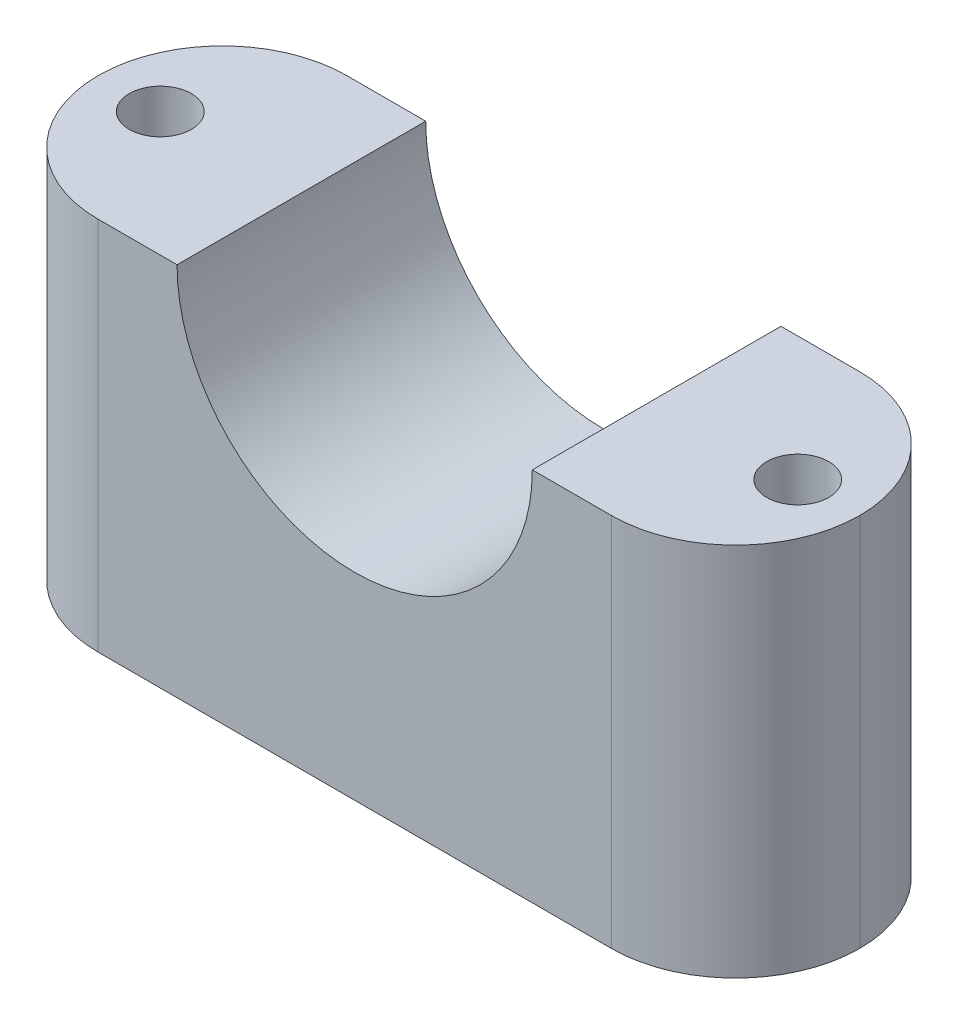
ISO-10303-21;
HEADER;
FILE_DESCRIPTION(('STEP AP214'),'2;1');
FILE_NAME('part.step','',(''),(''),'','','');
FILE_SCHEMA(('AUTOMOTIVE_DESIGN { 1 0 10303 214 1 1 1 1 }'));
ENDSEC;
DATA;
#1=APPLICATION_CONTEXT('core data for automotive mechanical design processes');
#2=APPLICATION_PROTOCOL_DEFINITION('international standard','automotive_design',2000,#1);
#3=PRODUCT_CONTEXT('',#1,'mechanical');
#4=PRODUCT('Part','Part','',(#3));
#5=PRODUCT_RELATED_PRODUCT_CATEGORY('part','',(#4));
#6=PRODUCT_DEFINITION_FORMATION('','',#4);
#7=PRODUCT_DEFINITION_CONTEXT('part definition',#1,'design');
#8=PRODUCT_DEFINITION('design','',#6,#7);
#9=PRODUCT_DEFINITION_SHAPE('','',#8);
#10=(LENGTH_UNIT() NAMED_UNIT(*) SI_UNIT(.MILLI.,.METRE.));
#11=(NAMED_UNIT(*) PLANE_ANGLE_UNIT() SI_UNIT($,.RADIAN.));
#12=(NAMED_UNIT(*) SI_UNIT($,.STERADIAN.) SOLID_ANGLE_UNIT());
#13=UNCERTAINTY_MEASURE_WITH_UNIT(LENGTH_MEASURE(1.E-05),#10,'distance_accuracy_value','');
#14=(GEOMETRIC_REPRESENTATION_CONTEXT(3) GLOBAL_UNCERTAINTY_ASSIGNED_CONTEXT((#13)) GLOBAL_UNIT_ASSIGNED_CONTEXT((#10,
#11,#12)) REPRESENTATION_CONTEXT('',''));
#15=CARTESIAN_POINT('',(0.,0.,0.));
#16=DIRECTION('',(0.,0.,1.));
#17=DIRECTION('',(1.,0.,0.));
#18=AXIS2_PLACEMENT_3D('',#15,#16,#17);
#19=CARTESIAN_POINT('',(41.02154,24.13,-7.99846));
#20=DIRECTION('',(0.,1.,0.));
#21=DIRECTION('',(0.,0.,1.));
#22=AXIS2_PLACEMENT_3D('',#19,#20,#21);
#23=PLANE('',#22);
#24=DIRECTION('',(0.,0.,1.));
#25=VECTOR('',#24,1.);
#26=CARTESIAN_POINT('',(13.08,24.13,-16.002));
#27=LINE('',#26,#25);
#28=CARTESIAN_POINT('',(13.08,24.13,-16.002));
#29=VERTEX_POINT('',#28);
#30=CARTESIAN_POINT('',(13.08,24.13,0.));
#31=VERTEX_POINT('',#30);
#32=EDGE_CURVE('E51',#29,#31,#27,.T.);
#33=ORIENTED_EDGE('',*,*,#32,.F.);
#34=DIRECTION('',(-1.,0.,0.));
#35=VECTOR('',#34,1.);
#36=CARTESIAN_POINT('',(7.99846000000006,24.13,-16.002));
#37=LINE('',#36,#35);
#38=CARTESIAN_POINT('',(7.99846000000006,24.13,-16.002));
#39=VERTEX_POINT('',#38);
#40=EDGE_CURVE('E202',#29,#39,#37,.T.);
#41=ORIENTED_EDGE('',*,*,#40,.T.);
#42=CARTESIAN_POINT('',(7.99846,24.13,-8.00354));
#43=DIRECTION('',(0.,1.,0.));
#44=DIRECTION('',(0.,0.,1.));
#45=AXIS2_PLACEMENT_3D('',#42,#43,#44);
#46=CIRCLE('',#45,7.99846);
#47=CARTESIAN_POINT('',(0.,24.13,-8.00353999999994));
#48=VERTEX_POINT('',#47);
#49=EDGE_CURVE('E126',#39,#48,#46,.T.);
#50=ORIENTED_EDGE('',*,*,#49,.T.);
#51=DIRECTION('',(0.,0.,1.));
#52=VECTOR('',#51,1.);
#53=CARTESIAN_POINT('',(0.,24.13,-7.99846000000006));
#54=LINE('',#53,#52);
#55=CARTESIAN_POINT('',(0.,24.13,-7.99846000000006));
#56=VERTEX_POINT('',#55);
#57=EDGE_CURVE('E118',#48,#56,#54,.T.);
#58=ORIENTED_EDGE('',*,*,#57,.T.);
#59=CARTESIAN_POINT('',(7.99846,24.13,-7.99846));
#60=DIRECTION('',(0.,1.,0.));
#61=DIRECTION('',(0.,0.,1.));
#62=AXIS2_PLACEMENT_3D('',#59,#60,#61);
#63=CIRCLE('',#62,7.99846);
#64=CARTESIAN_POINT('',(7.99846000000006,24.13,0.));
#65=VERTEX_POINT('',#64);
#66=EDGE_CURVE('E123',#56,#65,#63,.T.);
#67=ORIENTED_EDGE('',*,*,#66,.T.);
#68=DIRECTION('',(1.,0.,0.));
#69=VECTOR('',#68,1.);
#70=CARTESIAN_POINT('',(7.99846000000006,24.13,0.));
#71=LINE('',#70,#69);
#72=EDGE_CURVE('E144',#65,#31,#71,.T.);
#73=ORIENTED_EDGE('',*,*,#72,.T.);
#74=EDGE_LOOP('',(#33,#41,#50,#58,#67,#73));
#75=FACE_BOUND('',#74,.T.);
#76=CARTESIAN_POINT('',(4.,24.13,-8.001));
#77=DIRECTION('',(0.,1.,0.));
#78=DIRECTION('',(0.,0.,1.));
#79=AXIS2_PLACEMENT_3D('',#76,#77,#78);
#80=CIRCLE('',#79,2.);
#81=CARTESIAN_POINT('',(4.,24.13,-10.001));
#82=VERTEX_POINT('',#81);
#83=EDGE_CURVE('E153',#82,#82,#80,.T.);
#84=ORIENTED_EDGE('',*,*,#83,.F.);
#85=EDGE_LOOP('',(#84));
#86=FACE_BOUND('',#85,.T.);
#87=ADVANCED_FACE('F36',(#75,#86),#23,.T.);
#88=DIRECTION('',(0.,0.,1.));
#89=VECTOR('',#88,1.);
#90=CARTESIAN_POINT('',(35.94,24.13,-16.002));
#91=LINE('',#90,#89);
#92=CARTESIAN_POINT('',(35.94,24.13,0.));
#93=VERTEX_POINT('',#92);
#94=CARTESIAN_POINT('',(35.94,24.13,-16.002));
#95=VERTEX_POINT('',#94);
#96=EDGE_CURVE('E221',#93,#95,#91,.F.);
#97=ORIENTED_EDGE('',*,*,#96,.F.);
#98=CARTESIAN_POINT('',(41.0215399999999,24.13,0.));
#99=VERTEX_POINT('',#98);
#100=EDGE_CURVE('E59',#93,#99,#71,.T.);
#101=ORIENTED_EDGE('',*,*,#100,.T.);
#102=CARTESIAN_POINT('',(41.02154,24.13,-7.99846));
#103=DIRECTION('',(0.,1.,0.));
#104=DIRECTION('',(0.,0.,1.));
#105=AXIS2_PLACEMENT_3D('',#102,#103,#104);
#106=CIRCLE('',#105,7.99846);
#107=CARTESIAN_POINT('',(49.02,24.13,-7.99846000000006));
#108=VERTEX_POINT('',#107);
#109=EDGE_CURVE('E165',#99,#108,#106,.T.);
#110=ORIENTED_EDGE('',*,*,#109,.T.);
#111=DIRECTION('',(0.,0.,-1.));
#112=VECTOR('',#111,1.);
#113=CARTESIAN_POINT('',(49.02,24.13,-7.99846000000006));
#114=LINE('',#113,#112);
#115=CARTESIAN_POINT('',(49.02,24.13,-8.00353999999994));
#116=VERTEX_POINT('',#115);
#117=EDGE_CURVE('E102',#108,#116,#114,.T.);
#118=ORIENTED_EDGE('',*,*,#117,.T.);
#119=CARTESIAN_POINT('',(41.02154,24.13,-8.00354));
#120=DIRECTION('',(0.,1.,0.));
#121=DIRECTION('',(0.,0.,1.));
#122=AXIS2_PLACEMENT_3D('',#119,#120,#121);
#123=CIRCLE('',#122,7.99846);
#124=CARTESIAN_POINT('',(41.0215399999999,24.13,-16.002));
#125=VERTEX_POINT('',#124);
#126=EDGE_CURVE('E204',#116,#125,#123,.T.);
#127=ORIENTED_EDGE('',*,*,#126,.T.);
#128=EDGE_CURVE('E199',#125,#95,#37,.T.);
#129=ORIENTED_EDGE('',*,*,#128,.T.);
#130=EDGE_LOOP('',(#97,#101,#110,#118,#127,#129));
#131=FACE_BOUND('',#130,.T.);
#132=CARTESIAN_POINT('',(45.02,24.13,-8.001));
#133=DIRECTION('',(0.,1.,0.));
#134=DIRECTION('',(0.,0.,1.));
#135=AXIS2_PLACEMENT_3D('',#132,#133,#134);
#136=CIRCLE('',#135,2.);
#137=CARTESIAN_POINT('',(45.02,24.13,-10.001));
#138=VERTEX_POINT('',#137);
#139=EDGE_CURVE('E212',#138,#138,#136,.T.);
#140=ORIENTED_EDGE('',*,*,#139,.F.);
#141=EDGE_LOOP('',(#140));
#142=FACE_BOUND('',#141,.T.);
#143=ADVANCED_FACE('F227',(#131,#142),#23,.T.);
#144=CARTESIAN_POINT('',(41.02154,0.,-7.99846));
#145=DIRECTION('',(0.,1.,0.));
#146=DIRECTION('',(0.,0.,1.));
#147=AXIS2_PLACEMENT_3D('',#144,#145,#146);
#148=PLANE('',#147);
#149=CARTESIAN_POINT('',(41.02154,0.,-7.99846));
#150=DIRECTION('',(0.,1.,0.));
#151=DIRECTION('',(0.,0.,1.));
#152=AXIS2_PLACEMENT_3D('',#149,#150,#151);
#153=CIRCLE('',#152,7.99846);
#154=CARTESIAN_POINT('',(41.0215399999999,0.,0.));
#155=VERTEX_POINT('',#154);
#156=CARTESIAN_POINT('',(49.02,0.,-7.99846000000006));
#157=VERTEX_POINT('',#156);
#158=EDGE_CURVE('E149',#155,#157,#153,.T.);
#159=ORIENTED_EDGE('',*,*,#158,.F.);
#160=DIRECTION('',(1.,0.,0.));
#161=VECTOR('',#160,1.);
#162=CARTESIAN_POINT('',(7.99846000000006,0.,0.));
#163=LINE('',#162,#161);
#164=CARTESIAN_POINT('',(7.99846000000006,0.,0.));
#165=VERTEX_POINT('',#164);
#166=EDGE_CURVE('E93',#165,#155,#163,.T.);
#167=ORIENTED_EDGE('',*,*,#166,.F.);
#168=CARTESIAN_POINT('',(7.99846,0.,-7.99846));
#169=DIRECTION('',(0.,1.,0.));
#170=DIRECTION('',(0.,0.,1.));
#171=AXIS2_PLACEMENT_3D('',#168,#169,#170);
#172=CIRCLE('',#171,7.99846);
#173=CARTESIAN_POINT('',(0.,0.,-7.99846000000006));
#174=VERTEX_POINT('',#173);
#175=EDGE_CURVE('E162',#174,#165,#172,.T.);
#176=ORIENTED_EDGE('',*,*,#175,.F.);
#177=DIRECTION('',(0.,0.,1.));
#178=VECTOR('',#177,1.);
#179=CARTESIAN_POINT('',(0.,0.,-7.99846000000006));
#180=LINE('',#179,#178);
#181=CARTESIAN_POINT('',(0.,0.,-8.00353999999994));
#182=VERTEX_POINT('',#181);
#183=EDGE_CURVE('E135',#182,#174,#180,.T.);
#184=ORIENTED_EDGE('',*,*,#183,.F.);
#185=CARTESIAN_POINT('',(7.99846,0.,-8.00354));
#186=DIRECTION('',(0.,1.,0.));
#187=DIRECTION('',(0.,0.,1.));
#188=AXIS2_PLACEMENT_3D('',#185,#186,#187);
#189=CIRCLE('',#188,7.99846);
#190=CARTESIAN_POINT('',(7.99846000000006,0.,-16.002));
#191=VERTEX_POINT('',#190);
#192=EDGE_CURVE('E159',#191,#182,#189,.T.);
#193=ORIENTED_EDGE('',*,*,#192,.F.);
#194=DIRECTION('',(-1.,0.,0.));
#195=VECTOR('',#194,1.);
#196=CARTESIAN_POINT('',(7.99846000000006,0.,-16.002));
#197=LINE('',#196,#195);
#198=CARTESIAN_POINT('',(41.0215399999999,0.,-16.002));
#199=VERTEX_POINT('',#198);
#200=EDGE_CURVE('E157',#199,#191,#197,.T.);
#201=ORIENTED_EDGE('',*,*,#200,.F.);
#202=CARTESIAN_POINT('',(41.02154,0.,-8.00354));
#203=DIRECTION('',(0.,1.,0.));
#204=DIRECTION('',(0.,0.,1.));
#205=AXIS2_PLACEMENT_3D('',#202,#203,#204);
#206=CIRCLE('',#205,7.99846);
#207=CARTESIAN_POINT('',(49.02,0.,-8.00353999999994));
#208=VERTEX_POINT('',#207);
#209=EDGE_CURVE('E155',#208,#199,#206,.T.);
#210=ORIENTED_EDGE('',*,*,#209,.F.);
#211=DIRECTION('',(0.,0.,-1.));
#212=VECTOR('',#211,1.);
#213=CARTESIAN_POINT('',(49.02,0.,-7.99846000000006));
#214=LINE('',#213,#212);
#215=EDGE_CURVE('E152',#157,#208,#214,.T.);
#216=ORIENTED_EDGE('',*,*,#215,.F.);
#217=EDGE_LOOP('',(#159,#167,#176,#184,#193,#201,#210,#216));
#218=FACE_BOUND('',#217,.T.);
#219=CARTESIAN_POINT('',(4.,0.,-8.001));
#220=DIRECTION('',(0.,1.,0.));
#221=DIRECTION('',(0.,0.,1.));
#222=AXIS2_PLACEMENT_3D('',#219,#220,#221);
#223=CIRCLE('',#222,2.);
#224=CARTESIAN_POINT('',(4.,0.,-10.001));
#225=VERTEX_POINT('',#224);
#226=EDGE_CURVE('E209',#225,#225,#223,.T.);
#227=ORIENTED_EDGE('',*,*,#226,.T.);
#228=EDGE_LOOP('',(#227));
#229=FACE_BOUND('',#228,.T.);
#230=CARTESIAN_POINT('',(45.02,0.,-8.001));
#231=DIRECTION('',(0.,1.,0.));
#232=DIRECTION('',(0.,0.,1.));
#233=AXIS2_PLACEMENT_3D('',#230,#231,#232);
#234=CIRCLE('',#233,2.);
#235=CARTESIAN_POINT('',(45.02,0.,-10.001));
#236=VERTEX_POINT('',#235);
#237=EDGE_CURVE('E215',#236,#236,#234,.T.);
#238=ORIENTED_EDGE('',*,*,#237,.T.);
#239=EDGE_LOOP('',(#238));
#240=FACE_BOUND('',#239,.T.);
#241=ADVANCED_FACE('F183',(#218,#229,#240),#148,.F.);
#242=CARTESIAN_POINT('',(41.02154,24.13,-7.99846));
#243=DIRECTION('',(0.,-1.,0.));
#244=DIRECTION('',(0.,0.,-1.));
#245=AXIS2_PLACEMENT_3D('',#242,#243,#244);
#246=CYLINDRICAL_SURFACE('',#245,7.99846);
#247=ORIENTED_EDGE('',*,*,#158,.T.);
#248=DIRECTION('',(0.,-1.,0.));
#249=VECTOR('',#248,1.);
#250=CARTESIAN_POINT('',(49.02,24.13,-7.99846000000006));
#251=LINE('',#250,#249);
#252=EDGE_CURVE('E44',#108,#157,#251,.T.);
#253=ORIENTED_EDGE('',*,*,#252,.F.);
#254=ORIENTED_EDGE('',*,*,#109,.F.);
#255=DIRECTION('',(0.,-1.,0.));
#256=VECTOR('',#255,1.);
#257=CARTESIAN_POINT('',(41.0215399999999,24.13,0.));
#258=LINE('',#257,#256);
#259=EDGE_CURVE('E148',#99,#155,#258,.T.);
#260=ORIENTED_EDGE('',*,*,#259,.T.);
#261=EDGE_LOOP('',(#247,#253,#254,#260));
#262=FACE_BOUND('',#261,.T.);
#263=ADVANCED_FACE('F38',(#262),#246,.T.);
#264=CARTESIAN_POINT('',(49.02,24.13,-7.99846000000006));
#265=DIRECTION('',(-1.,0.,0.));
#266=DIRECTION('',(0.,0.,1.));
#267=AXIS2_PLACEMENT_3D('',#264,#265,#266);
#268=PLANE('',#267);
#269=ORIENTED_EDGE('',*,*,#215,.T.);
#270=DIRECTION('',(0.,-1.,0.));
#271=VECTOR('',#270,1.);
#272=CARTESIAN_POINT('',(49.02,24.13,-8.00353999999994));
#273=LINE('',#272,#271);
#274=EDGE_CURVE('E175',#116,#208,#273,.T.);
#275=ORIENTED_EDGE('',*,*,#274,.F.);
#276=ORIENTED_EDGE('',*,*,#117,.F.);
#277=ORIENTED_EDGE('',*,*,#252,.T.);
#278=EDGE_LOOP('',(#269,#275,#276,#277));
#279=FACE_BOUND('',#278,.T.);
#280=ADVANCED_FACE('F178',(#279),#268,.F.);
#281=CARTESIAN_POINT('',(41.02154,24.13,-8.00354));
#282=DIRECTION('',(0.,-1.,0.));
#283=DIRECTION('',(0.,0.,-1.));
#284=AXIS2_PLACEMENT_3D('',#281,#282,#283);
#285=CYLINDRICAL_SURFACE('',#284,7.99846);
#286=ORIENTED_EDGE('',*,*,#209,.T.);
#287=DIRECTION('',(0.,-1.,0.));
#288=VECTOR('',#287,1.);
#289=CARTESIAN_POINT('',(41.0215399999999,24.13,-16.002));
#290=LINE('',#289,#288);
#291=EDGE_CURVE('E172',#125,#199,#290,.T.);
#292=ORIENTED_EDGE('',*,*,#291,.F.);
#293=ORIENTED_EDGE('',*,*,#126,.F.);
#294=ORIENTED_EDGE('',*,*,#274,.T.);
#295=EDGE_LOOP('',(#286,#292,#293,#294));
#296=FACE_BOUND('',#295,.T.);
#297=ADVANCED_FACE('F190',(#296),#285,.T.);
#298=CARTESIAN_POINT('',(7.99846000000006,24.13,-16.002));
#299=DIRECTION('',(0.,0.,1.));
#300=DIRECTION('',(1.,0.,0.));
#301=AXIS2_PLACEMENT_3D('',#298,#299,#300);
#302=PLANE('',#301);
#303=ORIENTED_EDGE('',*,*,#40,.F.);
#304=CARTESIAN_POINT('',(24.51,24.13,-16.002));
#305=DIRECTION('',(0.,0.,1.));
#306=DIRECTION('',(1.,0.,0.));
#307=AXIS2_PLACEMENT_3D('',#304,#305,#306);
#308=CIRCLE('',#307,11.43);
#309=EDGE_CURVE('E201',#29,#95,#308,.T.);
#310=ORIENTED_EDGE('',*,*,#309,.T.);
#311=ORIENTED_EDGE('',*,*,#128,.F.);
#312=ORIENTED_EDGE('',*,*,#291,.T.);
#313=ORIENTED_EDGE('',*,*,#200,.T.);
#314=DIRECTION('',(0.,-1.,0.));
#315=VECTOR('',#314,1.);
#316=CARTESIAN_POINT('',(7.99846000000006,24.13,-16.002));
#317=LINE('',#316,#315);
#318=EDGE_CURVE('E169',#39,#191,#317,.T.);
#319=ORIENTED_EDGE('',*,*,#318,.F.);
#320=EDGE_LOOP('',(#303,#310,#311,#312,#313,#319));
#321=FACE_BOUND('',#320,.T.);
#322=ADVANCED_FACE('F195',(#321),#302,.F.);
#323=CARTESIAN_POINT('',(7.99846,24.13,-8.00354));
#324=DIRECTION('',(0.,-1.,0.));
#325=DIRECTION('',(0.,0.,-1.));
#326=AXIS2_PLACEMENT_3D('',#323,#324,#325);
#327=CYLINDRICAL_SURFACE('',#326,7.99846);
#328=ORIENTED_EDGE('',*,*,#192,.T.);
#329=DIRECTION('',(0.,-1.,0.));
#330=VECTOR('',#329,1.);
#331=CARTESIAN_POINT('',(0.,24.13,-8.00353999999994));
#332=LINE('',#331,#330);
#333=EDGE_CURVE('E138',#48,#182,#332,.T.);
#334=ORIENTED_EDGE('',*,*,#333,.F.);
#335=ORIENTED_EDGE('',*,*,#49,.F.);
#336=ORIENTED_EDGE('',*,*,#318,.T.);
#337=EDGE_LOOP('',(#328,#334,#335,#336));
#338=FACE_BOUND('',#337,.T.);
#339=ADVANCED_FACE('F231',(#338),#327,.T.);
#340=CARTESIAN_POINT('',(0.,24.13,-7.99846000000006));
#341=DIRECTION('',(1.,0.,0.));
#342=DIRECTION('',(0.,0.,-1.));
#343=AXIS2_PLACEMENT_3D('',#340,#341,#342);
#344=PLANE('',#343);
#345=ORIENTED_EDGE('',*,*,#183,.T.);
#346=DIRECTION('',(0.,-1.,0.));
#347=VECTOR('',#346,1.);
#348=CARTESIAN_POINT('',(0.,24.13,-7.99846000000006));
#349=LINE('',#348,#347);
#350=EDGE_CURVE('E132',#56,#174,#349,.T.);
#351=ORIENTED_EDGE('',*,*,#350,.F.);
#352=ORIENTED_EDGE('',*,*,#57,.F.);
#353=ORIENTED_EDGE('',*,*,#333,.T.);
#354=EDGE_LOOP('',(#345,#351,#352,#353));
#355=FACE_BOUND('',#354,.T.);
#356=ADVANCED_FACE('F133',(#355),#344,.F.);
#357=CARTESIAN_POINT('',(7.99846,24.13,-7.99846));
#358=DIRECTION('',(0.,-1.,0.));
#359=DIRECTION('',(0.,0.,-1.));
#360=AXIS2_PLACEMENT_3D('',#357,#358,#359);
#361=CYLINDRICAL_SURFACE('',#360,7.99846);
#362=ORIENTED_EDGE('',*,*,#175,.T.);
#363=DIRECTION('',(0.,-1.,0.));
#364=VECTOR('',#363,1.);
#365=CARTESIAN_POINT('',(7.99846000000006,24.13,0.));
#366=LINE('',#365,#364);
#367=EDGE_CURVE('E139',#65,#165,#366,.T.);
#368=ORIENTED_EDGE('',*,*,#367,.F.);
#369=ORIENTED_EDGE('',*,*,#66,.F.);
#370=ORIENTED_EDGE('',*,*,#350,.T.);
#371=EDGE_LOOP('',(#362,#368,#369,#370));
#372=FACE_BOUND('',#371,.T.);
#373=ADVANCED_FACE('F141',(#372),#361,.T.);
#374=CARTESIAN_POINT('',(7.99846000000006,24.13,0.));
#375=DIRECTION('',(0.,0.,-1.));
#376=DIRECTION('',(-1.,0.,0.));
#377=AXIS2_PLACEMENT_3D('',#374,#375,#376);
#378=PLANE('',#377);
#379=ORIENTED_EDGE('',*,*,#100,.F.);
#380=CARTESIAN_POINT('',(24.51,24.13,0.));
#381=DIRECTION('',(0.,0.,-1.));
#382=DIRECTION('',(-1.,0.,0.));
#383=AXIS2_PLACEMENT_3D('',#380,#381,#382);
#384=CIRCLE('',#383,11.43);
#385=EDGE_CURVE('E11',#93,#31,#384,.T.);
#386=ORIENTED_EDGE('',*,*,#385,.T.);
#387=ORIENTED_EDGE('',*,*,#72,.F.);
#388=ORIENTED_EDGE('',*,*,#367,.T.);
#389=ORIENTED_EDGE('',*,*,#166,.T.);
#390=ORIENTED_EDGE('',*,*,#259,.F.);
#391=EDGE_LOOP('',(#379,#386,#387,#388,#389,#390));
#392=FACE_BOUND('',#391,.T.);
#393=ADVANCED_FACE('F229',(#392),#378,.F.);
#394=CARTESIAN_POINT('',(4.,24.13,-8.001));
#395=DIRECTION('',(0.,-1.,0.));
#396=DIRECTION('',(0.,0.,-1.));
#397=AXIS2_PLACEMENT_3D('',#394,#395,#396);
#398=CYLINDRICAL_SURFACE('',#397,2.);
#399=CARTESIAN_POINT('',(4.,24.13,-10.001));
#400=CARTESIAN_POINT('',(4.,23.8786458333333,-10.001));
#401=CARTESIAN_POINT('',(4.,23.6272916666667,-10.001));
#402=CARTESIAN_POINT('',(4.,23.1245833333333,-10.001));
#403=CARTESIAN_POINT('',(4.,22.8732291666667,-10.001));
#404=CARTESIAN_POINT('',(4.,22.3705208333333,-10.001));
#405=CARTESIAN_POINT('',(4.,22.1191666666667,-10.001));
#406=CARTESIAN_POINT('',(4.,21.6164583333333,-10.001));
#407=CARTESIAN_POINT('',(4.,21.3651041666667,-10.001));
#408=CARTESIAN_POINT('',(4.,20.8623958333333,-10.001));
#409=CARTESIAN_POINT('',(4.,20.6110416666667,-10.001));
#410=CARTESIAN_POINT('',(4.,20.1083333333333,-10.001));
#411=CARTESIAN_POINT('',(4.,19.8569791666667,-10.001));
#412=CARTESIAN_POINT('',(4.,19.3542708333333,-10.001));
#413=CARTESIAN_POINT('',(4.,19.1029166666667,-10.001));
#414=CARTESIAN_POINT('',(4.,18.6002083333333,-10.001));
#415=CARTESIAN_POINT('',(4.,18.3488541666667,-10.001));
#416=CARTESIAN_POINT('',(4.,17.8461458333333,-10.001));
#417=CARTESIAN_POINT('',(4.,17.5947916666667,-10.001));
#418=CARTESIAN_POINT('',(4.,17.0920833333333,-10.001));
#419=CARTESIAN_POINT('',(4.,16.8407291666667,-10.001));
#420=CARTESIAN_POINT('',(4.,16.3380208333333,-10.001));
#421=CARTESIAN_POINT('',(4.,16.0866666666667,-10.001));
#422=CARTESIAN_POINT('',(4.,15.5839583333333,-10.001));
#423=CARTESIAN_POINT('',(4.,15.3326041666667,-10.001));
#424=CARTESIAN_POINT('',(4.,14.8298958333333,-10.001));
#425=CARTESIAN_POINT('',(4.,14.5785416666667,-10.001));
#426=CARTESIAN_POINT('',(4.,14.0758333333333,-10.001));
#427=CARTESIAN_POINT('',(4.,13.8244791666667,-10.001));
#428=CARTESIAN_POINT('',(4.,13.3217708333333,-10.001));
#429=CARTESIAN_POINT('',(4.,13.0704166666667,-10.001));
#430=CARTESIAN_POINT('',(4.,12.5677083333333,-10.001));
#431=CARTESIAN_POINT('',(4.,12.3163541666667,-10.001));
#432=CARTESIAN_POINT('',(4.,11.8136458333333,-10.001));
#433=CARTESIAN_POINT('',(4.,11.5622916666667,-10.001));
#434=CARTESIAN_POINT('',(4.,11.0595833333333,-10.001));
#435=CARTESIAN_POINT('',(4.,10.8082291666667,-10.001));
#436=CARTESIAN_POINT('',(4.,10.3055208333333,-10.001));
#437=CARTESIAN_POINT('',(4.,10.0541666666667,-10.001));
#438=CARTESIAN_POINT('',(4.,9.55145833333333,-10.001));
#439=CARTESIAN_POINT('',(4.,9.30010416666667,-10.001));
#440=CARTESIAN_POINT('',(4.,8.79739583333333,-10.001));
#441=CARTESIAN_POINT('',(4.,8.54604166666667,-10.001));
#442=CARTESIAN_POINT('',(4.,8.04333333333333,-10.001));
#443=CARTESIAN_POINT('',(4.,7.79197916666666,-10.001));
#444=CARTESIAN_POINT('',(4.,7.28927083333333,-10.001));
#445=CARTESIAN_POINT('',(4.,7.03791666666666,-10.001));
#446=CARTESIAN_POINT('',(4.,6.53520833333333,-10.001));
#447=CARTESIAN_POINT('',(4.,6.28385416666666,-10.001));
#448=CARTESIAN_POINT('',(4.,5.78114583333333,-10.001));
#449=CARTESIAN_POINT('',(4.,5.52979166666666,-10.001));
#450=CARTESIAN_POINT('',(4.,5.02708333333333,-10.001));
#451=CARTESIAN_POINT('',(4.,4.77572916666666,-10.001));
#452=CARTESIAN_POINT('',(4.,4.27302083333333,-10.001));
#453=CARTESIAN_POINT('',(4.,4.02166666666666,-10.001));
#454=CARTESIAN_POINT('',(4.,3.51895833333333,-10.001));
#455=CARTESIAN_POINT('',(4.,3.26760416666666,-10.001));
#456=CARTESIAN_POINT('',(4.,2.76489583333333,-10.001));
#457=CARTESIAN_POINT('',(4.,2.51354166666666,-10.001));
#458=CARTESIAN_POINT('',(4.,2.01083333333333,-10.001));
#459=CARTESIAN_POINT('',(4.,1.75947916666666,-10.001));
#460=CARTESIAN_POINT('',(4.,1.25677083333333,-10.001));
#461=CARTESIAN_POINT('',(4.,1.00541666666666,-10.001));
#462=CARTESIAN_POINT('',(4.,0.50270833333333,-10.001));
#463=CARTESIAN_POINT('',(4.,0.251354166666663,-10.001));
#464=CARTESIAN_POINT('',(4.,0.,-10.001));
#465=B_SPLINE_CURVE_WITH_KNOTS('',3,(#399,#400,#401,#402,#403,#404,#405,#406,#407,#408,#409,
#410,#411,#412,#413,#414,#415,#416,#417,#418,#419,#420,#421,#422,#423,#424,#425,#426,#427,#428,
#429,#430,#431,#432,#433,#434,#435,#436,#437,#438,#439,#440,#441,#442,#443,#444,#445,#446,#447,
#448,#449,#450,#451,#452,#453,#454,#455,#456,#457,#458,#459,#460,#461,#462,#463,#464),
.UNSPECIFIED.,.F.,.F.,(4,2,2,2,2,2,2,2,2,2,2,2,2,2,2,2,2,2,2,2,2,2,2,2,2,2,2,2,2,2,2,2,4),(0.,
0.7540625,1.508125,2.2621875,3.01625,3.7703125,4.524375,5.2784375,6.0325,6.7865625,7.540625,
8.2946875,9.04875,9.8028125,10.556875,11.3109375,12.065,12.8190625,13.573125,14.3271875,
15.08125,15.8353125,16.589375,17.3434375,18.0975,18.8515625,19.605625,20.3596875,21.11375,
21.8678125,22.621875,23.3759375,24.13),.UNSPECIFIED.);
#466=EDGE_CURVE('BSEAM247',#82,#225,#465,.T.);
#467=ORIENTED_EDGE('',*,*,#83,.T.);
#468=ORIENTED_EDGE('',*,*,#226,.F.);
#469=ORIENTED_EDGE('',*,*,#466,.T.);
#470=ORIENTED_EDGE('',*,*,#466,.F.);
#471=EDGE_LOOP('',(#467,#469,#468,#470));
#472=FACE_BOUND('',#471,.T.);
#473=ADVANCED_FACE('F247',(#472),#398,.F.);
#474=CARTESIAN_POINT('',(45.02,24.13,-8.001));
#475=DIRECTION('',(0.,-1.,0.));
#476=DIRECTION('',(0.,0.,-1.));
#477=AXIS2_PLACEMENT_3D('',#474,#475,#476);
#478=CYLINDRICAL_SURFACE('',#477,2.);
#479=CARTESIAN_POINT('',(45.02,24.13,-10.001));
#480=CARTESIAN_POINT('',(45.02,23.8786458333333,-10.001));
#481=CARTESIAN_POINT('',(45.02,23.6272916666667,-10.001));
#482=CARTESIAN_POINT('',(45.02,23.1245833333333,-10.001));
#483=CARTESIAN_POINT('',(45.02,22.8732291666667,-10.001));
#484=CARTESIAN_POINT('',(45.02,22.3705208333333,-10.001));
#485=CARTESIAN_POINT('',(45.02,22.1191666666667,-10.001));
#486=CARTESIAN_POINT('',(45.02,21.6164583333333,-10.001));
#487=CARTESIAN_POINT('',(45.02,21.3651041666667,-10.001));
#488=CARTESIAN_POINT('',(45.02,20.8623958333333,-10.001));
#489=CARTESIAN_POINT('',(45.02,20.6110416666667,-10.001));
#490=CARTESIAN_POINT('',(45.02,20.1083333333333,-10.001));
#491=CARTESIAN_POINT('',(45.02,19.8569791666667,-10.001));
#492=CARTESIAN_POINT('',(45.02,19.3542708333333,-10.001));
#493=CARTESIAN_POINT('',(45.02,19.1029166666667,-10.001));
#494=CARTESIAN_POINT('',(45.02,18.6002083333333,-10.001));
#495=CARTESIAN_POINT('',(45.02,18.3488541666667,-10.001));
#496=CARTESIAN_POINT('',(45.02,17.8461458333333,-10.001));
#497=CARTESIAN_POINT('',(45.02,17.5947916666667,-10.001));
#498=CARTESIAN_POINT('',(45.02,17.0920833333333,-10.001));
#499=CARTESIAN_POINT('',(45.02,16.8407291666667,-10.001));
#500=CARTESIAN_POINT('',(45.02,16.3380208333333,-10.001));
#501=CARTESIAN_POINT('',(45.02,16.0866666666667,-10.001));
#502=CARTESIAN_POINT('',(45.02,15.5839583333333,-10.001));
#503=CARTESIAN_POINT('',(45.02,15.3326041666667,-10.001));
#504=CARTESIAN_POINT('',(45.02,14.8298958333333,-10.001));
#505=CARTESIAN_POINT('',(45.02,14.5785416666667,-10.001));
#506=CARTESIAN_POINT('',(45.02,14.0758333333333,-10.001));
#507=CARTESIAN_POINT('',(45.02,13.8244791666667,-10.001));
#508=CARTESIAN_POINT('',(45.02,13.3217708333333,-10.001));
#509=CARTESIAN_POINT('',(45.02,13.0704166666667,-10.001));
#510=CARTESIAN_POINT('',(45.02,12.5677083333333,-10.001));
#511=CARTESIAN_POINT('',(45.02,12.3163541666667,-10.001));
#512=CARTESIAN_POINT('',(45.02,11.8136458333333,-10.001));
#513=CARTESIAN_POINT('',(45.02,11.5622916666667,-10.001));
#514=CARTESIAN_POINT('',(45.02,11.0595833333333,-10.001));
#515=CARTESIAN_POINT('',(45.02,10.8082291666667,-10.001));
#516=CARTESIAN_POINT('',(45.02,10.3055208333333,-10.001));
#517=CARTESIAN_POINT('',(45.02,10.0541666666667,-10.001));
#518=CARTESIAN_POINT('',(45.02,9.55145833333333,-10.001));
#519=CARTESIAN_POINT('',(45.02,9.30010416666667,-10.001));
#520=CARTESIAN_POINT('',(45.02,8.79739583333333,-10.001));
#521=CARTESIAN_POINT('',(45.02,8.54604166666667,-10.001));
#522=CARTESIAN_POINT('',(45.02,8.04333333333333,-10.001));
#523=CARTESIAN_POINT('',(45.02,7.79197916666666,-10.001));
#524=CARTESIAN_POINT('',(45.02,7.28927083333333,-10.001));
#525=CARTESIAN_POINT('',(45.02,7.03791666666666,-10.001));
#526=CARTESIAN_POINT('',(45.02,6.53520833333333,-10.001));
#527=CARTESIAN_POINT('',(45.02,6.28385416666666,-10.001));
#528=CARTESIAN_POINT('',(45.02,5.78114583333333,-10.001));
#529=CARTESIAN_POINT('',(45.02,5.52979166666666,-10.001));
#530=CARTESIAN_POINT('',(45.02,5.02708333333333,-10.001));
#531=CARTESIAN_POINT('',(45.02,4.77572916666666,-10.001));
#532=CARTESIAN_POINT('',(45.02,4.27302083333333,-10.001));
#533=CARTESIAN_POINT('',(45.02,4.02166666666666,-10.001));
#534=CARTESIAN_POINT('',(45.02,3.51895833333333,-10.001));
#535=CARTESIAN_POINT('',(45.02,3.26760416666666,-10.001));
#536=CARTESIAN_POINT('',(45.02,2.76489583333333,-10.001));
#537=CARTESIAN_POINT('',(45.02,2.51354166666666,-10.001));
#538=CARTESIAN_POINT('',(45.02,2.01083333333333,-10.001));
#539=CARTESIAN_POINT('',(45.02,1.75947916666666,-10.001));
#540=CARTESIAN_POINT('',(45.02,1.25677083333333,-10.001));
#541=CARTESIAN_POINT('',(45.02,1.00541666666666,-10.001));
#542=CARTESIAN_POINT('',(45.02,0.50270833333333,-10.001));
#543=CARTESIAN_POINT('',(45.02,0.251354166666663,-10.001));
#544=CARTESIAN_POINT('',(45.02,0.,-10.001));
#545=B_SPLINE_CURVE_WITH_KNOTS('',3,(#479,#480,#481,#482,#483,#484,#485,#486,#487,#488,#489,
#490,#491,#492,#493,#494,#495,#496,#497,#498,#499,#500,#501,#502,#503,#504,#505,#506,#507,#508,
#509,#510,#511,#512,#513,#514,#515,#516,#517,#518,#519,#520,#521,#522,#523,#524,#525,#526,#527,
#528,#529,#530,#531,#532,#533,#534,#535,#536,#537,#538,#539,#540,#541,#542,#543,#544),
.UNSPECIFIED.,.F.,.F.,(4,2,2,2,2,2,2,2,2,2,2,2,2,2,2,2,2,2,2,2,2,2,2,2,2,2,2,2,2,2,2,2,4),(0.,
0.7540625,1.508125,2.2621875,3.01625,3.7703125,4.524375,5.2784375,6.0325,6.7865625,7.540625,
8.2946875,9.04875,9.8028125,10.556875,11.3109375,12.065,12.8190625,13.573125,14.3271875,
15.08125,15.8353125,16.589375,17.3434375,18.0975,18.8515625,19.605625,20.3596875,21.11375,
21.8678125,22.621875,23.3759375,24.13),.UNSPECIFIED.);
#546=EDGE_CURVE('BSEAM270',#138,#236,#545,.T.);
#547=ORIENTED_EDGE('',*,*,#139,.T.);
#548=ORIENTED_EDGE('',*,*,#237,.F.);
#549=ORIENTED_EDGE('',*,*,#546,.T.);
#550=ORIENTED_EDGE('',*,*,#546,.F.);
#551=EDGE_LOOP('',(#547,#549,#548,#550));
#552=FACE_BOUND('',#551,.T.);
#553=ADVANCED_FACE('F270',(#552),#478,.F.);
#554=CARTESIAN_POINT('',(24.51,24.13,-16.002));
#555=DIRECTION('',(0.,0.,1.));
#556=DIRECTION('',(1.,0.,0.));
#557=AXIS2_PLACEMENT_3D('',#554,#555,#556);
#558=CYLINDRICAL_SURFACE('',#557,11.43);
#559=ORIENTED_EDGE('',*,*,#32,.T.);
#560=ORIENTED_EDGE('',*,*,#385,.F.);
#561=ORIENTED_EDGE('',*,*,#96,.T.);
#562=ORIENTED_EDGE('',*,*,#309,.F.);
#563=EDGE_LOOP('',(#559,#560,#561,#562));
#564=FACE_BOUND('',#563,.T.);
#565=ADVANCED_FACE('F224',(#564),#558,.F.);
#566=CLOSED_SHELL('',(#87,#143,#241,#263,#280,#297,#322,#339,#356,#373,#393,#473,#553,#565));
#567=MANIFOLD_SOLID_BREP('B2',#566);
#568=ADVANCED_BREP_SHAPE_REPRESENTATION('',(#18,#567),#14);
#569=SHAPE_DEFINITION_REPRESENTATION(#9,#568);
ENDSEC;
END-ISO-10303-21;
